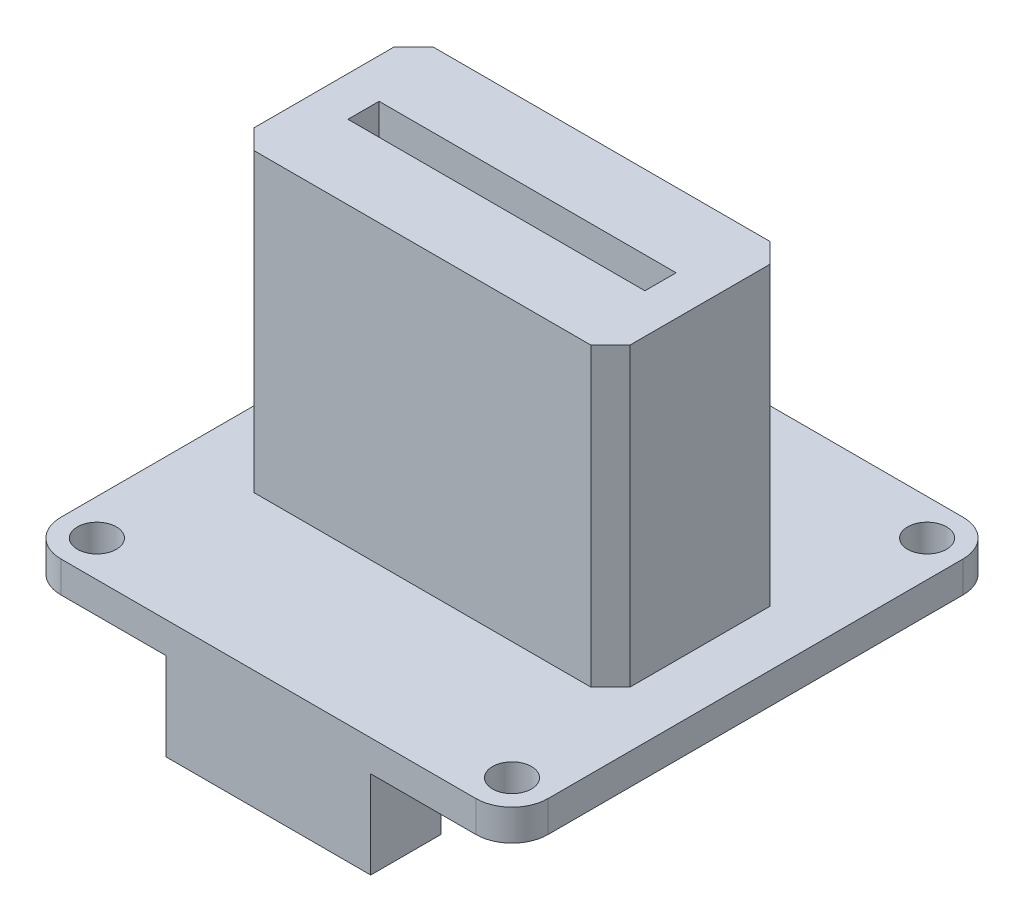
ISO-10303-21;
HEADER;
FILE_DESCRIPTION(('STEP AP214'),'2;1');
FILE_NAME('part.step','',(''),(''),'','','');
FILE_SCHEMA(('AUTOMOTIVE_DESIGN { 1 0 10303 214 1 1 1 1 }'));
ENDSEC;
DATA;
#1=APPLICATION_CONTEXT('core data for automotive mechanical design processes');
#2=APPLICATION_PROTOCOL_DEFINITION('international standard','automotive_design',2000,#1);
#3=PRODUCT_CONTEXT('',#1,'mechanical');
#4=PRODUCT('Part','Part','',(#3));
#5=PRODUCT_RELATED_PRODUCT_CATEGORY('part','',(#4));
#6=PRODUCT_DEFINITION_FORMATION('','',#4);
#7=PRODUCT_DEFINITION_CONTEXT('part definition',#1,'design');
#8=PRODUCT_DEFINITION('design','',#6,#7);
#9=PRODUCT_DEFINITION_SHAPE('','',#8);
#10=(LENGTH_UNIT() NAMED_UNIT(*) SI_UNIT(.MILLI.,.METRE.));
#11=(NAMED_UNIT(*) PLANE_ANGLE_UNIT() SI_UNIT($,.RADIAN.));
#12=(NAMED_UNIT(*) SI_UNIT($,.STERADIAN.) SOLID_ANGLE_UNIT());
#13=UNCERTAINTY_MEASURE_WITH_UNIT(LENGTH_MEASURE(1.E-05),#10,'distance_accuracy_value','');
#14=(GEOMETRIC_REPRESENTATION_CONTEXT(3) GLOBAL_UNCERTAINTY_ASSIGNED_CONTEXT((#13)) GLOBAL_UNIT_ASSIGNED_CONTEXT((#10,
#11,#12)) REPRESENTATION_CONTEXT('',''));
#15=CARTESIAN_POINT('',(0.,0.,0.));
#16=DIRECTION('',(0.,0.,1.));
#17=DIRECTION('',(1.,0.,0.));
#18=AXIS2_PLACEMENT_3D('',#15,#16,#17);
#19=CARTESIAN_POINT('',(-10.65,1.6,10.65));
#20=DIRECTION('',(0.,1.,0.));
#21=DIRECTION('',(0.,0.,1.));
#22=AXIS2_PLACEMENT_3D('',#19,#20,#21);
#23=PLANE('',#22);
#24=DIRECTION('',(-0.707106781186548,0.,0.707106781186547));
#25=VECTOR('',#24,1.);
#26=CARTESIAN_POINT('',(-6.62499999999999,1.6,-6.625));
#27=LINE('',#26,#25);
#28=CARTESIAN_POINT('',(-8.65,1.6,-4.6));
#29=VERTEX_POINT('',#28);
#30=CARTESIAN_POINT('',(-9.65,1.6,-3.6));
#31=VERTEX_POINT('',#30);
#32=EDGE_CURVE('E306',#29,#31,#27,.T.);
#33=ORIENTED_EDGE('',*,*,#32,.F.);
#34=DIRECTION('',(1.,0.,0.));
#35=VECTOR('',#34,1.);
#36=CARTESIAN_POINT('',(-10.65,1.6,-4.6));
#37=LINE('',#36,#35);
#38=CARTESIAN_POINT('',(8.65,1.6,-4.6));
#39=VERTEX_POINT('',#38);
#40=EDGE_CURVE('E351',#29,#39,#37,.T.);
#41=ORIENTED_EDGE('',*,*,#40,.T.);
#42=DIRECTION('',(-0.707106781186548,0.,-0.707106781186547));
#43=VECTOR('',#42,1.);
#44=CARTESIAN_POINT('',(6.625,1.6,-6.625));
#45=LINE('',#44,#43);
#46=CARTESIAN_POINT('',(9.65,1.6,-3.6));
#47=VERTEX_POINT('',#46);
#48=EDGE_CURVE('E322',#47,#39,#45,.T.);
#49=ORIENTED_EDGE('',*,*,#48,.F.);
#50=DIRECTION('',(0.,0.,1.));
#51=VECTOR('',#50,1.);
#52=CARTESIAN_POINT('',(9.65000000000001,1.6,10.65));
#53=LINE('',#52,#51);
#54=CARTESIAN_POINT('',(9.65,1.6,3.6));
#55=VERTEX_POINT('',#54);
#56=EDGE_CURVE('E374',#47,#55,#53,.T.);
#57=ORIENTED_EDGE('',*,*,#56,.T.);
#58=DIRECTION('',(0.707106781186547,0.,-0.707106781186548));
#59=VECTOR('',#58,1.);
#60=CARTESIAN_POINT('',(6.62500000000001,1.6,6.625));
#61=LINE('',#60,#59);
#62=CARTESIAN_POINT('',(8.65000000000001,1.6,4.6));
#63=VERTEX_POINT('',#62);
#64=EDGE_CURVE('E290',#63,#55,#61,.T.);
#65=ORIENTED_EDGE('',*,*,#64,.F.);
#66=DIRECTION('',(-1.,0.,0.));
#67=VECTOR('',#66,1.);
#68=CARTESIAN_POINT('',(-10.65,1.6,4.6));
#69=LINE('',#68,#67);
#70=CARTESIAN_POINT('',(-8.65,1.6,4.6));
#71=VERTEX_POINT('',#70);
#72=EDGE_CURVE('E377',#63,#71,#69,.T.);
#73=ORIENTED_EDGE('',*,*,#72,.T.);
#74=DIRECTION('',(0.707106781186548,0.,0.707106781186547));
#75=VECTOR('',#74,1.);
#76=CARTESIAN_POINT('',(-6.625,1.6,6.625));
#77=LINE('',#76,#75);
#78=CARTESIAN_POINT('',(-9.65,1.6,3.6));
#79=VERTEX_POINT('',#78);
#80=EDGE_CURVE('E297',#79,#71,#77,.T.);
#81=ORIENTED_EDGE('',*,*,#80,.F.);
#82=DIRECTION('',(0.,0.,-1.));
#83=VECTOR('',#82,1.);
#84=CARTESIAN_POINT('',(-9.65,1.6,10.65));
#85=LINE('',#84,#83);
#86=EDGE_CURVE('E362',#79,#31,#85,.T.);
#87=ORIENTED_EDGE('',*,*,#86,.T.);
#88=EDGE_LOOP('',(#33,#41,#49,#57,#65,#73,#81,#87));
#89=FACE_BOUND('',#88,.T.);
#90=CARTESIAN_POINT('',(-10.65,1.6,10.65));
#91=DIRECTION('',(0.,1.,0.));
#92=DIRECTION('',(0.,0.,1.));
#93=AXIS2_PLACEMENT_3D('',#90,#91,#92);
#94=CIRCLE('',#93,1.);
#95=CARTESIAN_POINT('',(-10.65,1.6,11.65));
#96=VERTEX_POINT('',#95);
#97=EDGE_CURVE('E388',#96,#96,#94,.T.);
#98=ORIENTED_EDGE('',*,*,#97,.F.);
#99=EDGE_LOOP('',(#98));
#100=FACE_BOUND('',#99,.T.);
#101=CARTESIAN_POINT('',(-10.65,1.6,-10.65));
#102=DIRECTION('',(0.,1.,0.));
#103=DIRECTION('',(0.,0.,1.));
#104=AXIS2_PLACEMENT_3D('',#101,#102,#103);
#105=CIRCLE('',#104,0.999999999999999);
#106=CARTESIAN_POINT('',(-10.65,1.6,-9.65));
#107=VERTEX_POINT('',#106);
#108=EDGE_CURVE('E400',#107,#107,#105,.T.);
#109=ORIENTED_EDGE('',*,*,#108,.F.);
#110=EDGE_LOOP('',(#109));
#111=FACE_BOUND('',#110,.T.);
#112=CARTESIAN_POINT('',(-10.65,1.6,10.65));
#113=DIRECTION('',(0.,1.,0.));
#114=DIRECTION('',(0.,0.,1.));
#115=AXIS2_PLACEMENT_3D('',#112,#113,#114);
#116=CIRCLE('',#115,1.85);
#117=CARTESIAN_POINT('',(-12.5,1.6,10.65));
#118=VERTEX_POINT('',#117);
#119=CARTESIAN_POINT('',(-10.65,1.6,12.5));
#120=VERTEX_POINT('',#119);
#121=EDGE_CURVE('E406',#118,#120,#116,.T.);
#122=ORIENTED_EDGE('',*,*,#121,.T.);
#123=DIRECTION('',(1.,0.,0.));
#124=VECTOR('',#123,1.);
#125=CARTESIAN_POINT('',(-10.65,1.6,12.5));
#126=LINE('',#125,#124);
#127=CARTESIAN_POINT('',(10.65,1.6,12.5));
#128=VERTEX_POINT('',#127);
#129=EDGE_CURVE('E409',#120,#128,#126,.T.);
#130=ORIENTED_EDGE('',*,*,#129,.T.);
#131=CARTESIAN_POINT('',(10.65,1.6,10.65));
#132=DIRECTION('',(0.,1.,0.));
#133=DIRECTION('',(0.,0.,1.));
#134=AXIS2_PLACEMENT_3D('',#131,#132,#133);
#135=CIRCLE('',#134,1.85);
#136=CARTESIAN_POINT('',(12.5,1.6,10.65));
#137=VERTEX_POINT('',#136);
#138=EDGE_CURVE('E412',#128,#137,#135,.T.);
#139=ORIENTED_EDGE('',*,*,#138,.T.);
#140=DIRECTION('',(0.,0.,-1.));
#141=VECTOR('',#140,1.);
#142=CARTESIAN_POINT('',(12.5,1.6,-10.65));
#143=LINE('',#142,#141);
#144=CARTESIAN_POINT('',(12.5,1.6,-10.65));
#145=VERTEX_POINT('',#144);
#146=EDGE_CURVE('E414',#137,#145,#143,.T.);
#147=ORIENTED_EDGE('',*,*,#146,.T.);
#148=CARTESIAN_POINT('',(10.65,1.6,-10.65));
#149=DIRECTION('',(0.,1.,0.));
#150=DIRECTION('',(0.,0.,1.));
#151=AXIS2_PLACEMENT_3D('',#148,#149,#150);
#152=CIRCLE('',#151,1.85);
#153=CARTESIAN_POINT('',(10.65,1.6,-12.5));
#154=VERTEX_POINT('',#153);
#155=EDGE_CURVE('E416',#145,#154,#152,.T.);
#156=ORIENTED_EDGE('',*,*,#155,.T.);
#157=DIRECTION('',(-1.,0.,0.));
#158=VECTOR('',#157,1.);
#159=CARTESIAN_POINT('',(-10.65,1.6,-12.5));
#160=LINE('',#159,#158);
#161=CARTESIAN_POINT('',(-10.65,1.6,-12.5));
#162=VERTEX_POINT('',#161);
#163=EDGE_CURVE('E418',#154,#162,#160,.T.);
#164=ORIENTED_EDGE('',*,*,#163,.T.);
#165=CARTESIAN_POINT('',(-10.65,1.6,-10.65));
#166=DIRECTION('',(0.,1.,0.));
#167=DIRECTION('',(0.,0.,1.));
#168=AXIS2_PLACEMENT_3D('',#165,#166,#167);
#169=CIRCLE('',#168,1.85);
#170=CARTESIAN_POINT('',(-12.5,1.6,-10.65));
#171=VERTEX_POINT('',#170);
#172=EDGE_CURVE('E420',#162,#171,#169,.T.);
#173=ORIENTED_EDGE('',*,*,#172,.T.);
#174=DIRECTION('',(0.,0.,1.));
#175=VECTOR('',#174,1.);
#176=CARTESIAN_POINT('',(-12.5,1.6,-10.65));
#177=LINE('',#176,#175);
#178=EDGE_CURVE('E422',#171,#118,#177,.T.);
#179=ORIENTED_EDGE('',*,*,#178,.T.);
#180=EDGE_LOOP('',(#122,#130,#139,#147,#156,#164,#173,#179));
#181=FACE_BOUND('',#180,.T.);
#182=CARTESIAN_POINT('',(10.65,1.6,-10.65));
#183=DIRECTION('',(0.,1.,0.));
#184=DIRECTION('',(0.,0.,1.));
#185=AXIS2_PLACEMENT_3D('',#182,#183,#184);
#186=CIRCLE('',#185,1.);
#187=CARTESIAN_POINT('',(10.65,1.6,-9.64999999999999));
#188=VERTEX_POINT('',#187);
#189=EDGE_CURVE('E394',#188,#188,#186,.T.);
#190=ORIENTED_EDGE('',*,*,#189,.F.);
#191=EDGE_LOOP('',(#190));
#192=FACE_BOUND('',#191,.T.);
#193=CARTESIAN_POINT('',(10.65,1.6,10.65));
#194=DIRECTION('',(0.,1.,0.));
#195=DIRECTION('',(0.,0.,1.));
#196=AXIS2_PLACEMENT_3D('',#193,#194,#195);
#197=CIRCLE('',#196,1.);
#198=CARTESIAN_POINT('',(10.65,1.6,11.65));
#199=VERTEX_POINT('',#198);
#200=EDGE_CURVE('E382',#199,#199,#197,.T.);
#201=ORIENTED_EDGE('',*,*,#200,.F.);
#202=EDGE_LOOP('',(#201));
#203=FACE_BOUND('',#202,.T.);
#204=ADVANCED_FACE('F42',(#89,#100,#111,#181,#192,#203),#23,.T.);
#205=CARTESIAN_POINT('',(-10.65,0.,10.65));
#206=DIRECTION('',(0.,1.,0.));
#207=DIRECTION('',(0.,0.,1.));
#208=AXIS2_PLACEMENT_3D('',#205,#206,#207);
#209=PLANE('',#208);
#210=DIRECTION('',(-1.,0.,0.));
#211=VECTOR('',#210,1.);
#212=CARTESIAN_POINT('',(-10.65,0.,-12.5));
#213=LINE('',#212,#211);
#214=CARTESIAN_POINT('',(-7.5,0.,-12.5));
#215=VERTEX_POINT('',#214);
#216=CARTESIAN_POINT('',(-10.65,0.,-12.5));
#217=VERTEX_POINT('',#216);
#218=EDGE_CURVE('E437',#215,#217,#213,.T.);
#219=ORIENTED_EDGE('',*,*,#218,.F.);
#220=DIRECTION('',(0.,0.,1.));
#221=VECTOR('',#220,1.);
#222=CARTESIAN_POINT('',(-7.5,0.,-8.9));
#223=LINE('',#222,#221);
#224=CARTESIAN_POINT('',(-7.5,0.,-8.9));
#225=VERTEX_POINT('',#224);
#226=EDGE_CURVE('E57',#215,#225,#223,.T.);
#227=ORIENTED_EDGE('',*,*,#226,.T.);
#228=DIRECTION('',(1.,0.,0.));
#229=VECTOR('',#228,1.);
#230=CARTESIAN_POINT('',(-7.5,0.,-8.9));
#231=LINE('',#230,#229);
#232=CARTESIAN_POINT('',(7.5,0.,-8.9));
#233=VERTEX_POINT('',#232);
#234=EDGE_CURVE('E232',#225,#233,#231,.T.);
#235=ORIENTED_EDGE('',*,*,#234,.T.);
#236=DIRECTION('',(0.,0.,-1.));
#237=VECTOR('',#236,1.);
#238=CARTESIAN_POINT('',(7.5,0.,-8.9));
#239=LINE('',#238,#237);
#240=CARTESIAN_POINT('',(7.5,0.,-12.5));
#241=VERTEX_POINT('',#240);
#242=EDGE_CURVE('E249',#233,#241,#239,.T.);
#243=ORIENTED_EDGE('',*,*,#242,.T.);
#244=CARTESIAN_POINT('',(10.65,0.,-12.5));
#245=VERTEX_POINT('',#244);
#246=EDGE_CURVE('E438',#245,#241,#213,.T.);
#247=ORIENTED_EDGE('',*,*,#246,.F.);
#248=CARTESIAN_POINT('',(10.65,0.,-10.65));
#249=DIRECTION('',(0.,1.,0.));
#250=DIRECTION('',(0.,0.,1.));
#251=AXIS2_PLACEMENT_3D('',#248,#249,#250);
#252=CIRCLE('',#251,1.85);
#253=CARTESIAN_POINT('',(12.5,0.,-10.65));
#254=VERTEX_POINT('',#253);
#255=EDGE_CURVE('E435',#254,#245,#252,.T.);
#256=ORIENTED_EDGE('',*,*,#255,.F.);
#257=DIRECTION('',(0.,0.,-1.));
#258=VECTOR('',#257,1.);
#259=CARTESIAN_POINT('',(12.5,0.,-10.65));
#260=LINE('',#259,#258);
#261=CARTESIAN_POINT('',(12.5,0.,10.65));
#262=VERTEX_POINT('',#261);
#263=EDGE_CURVE('E433',#262,#254,#260,.T.);
#264=ORIENTED_EDGE('',*,*,#263,.F.);
#265=CARTESIAN_POINT('',(10.65,0.,10.65));
#266=DIRECTION('',(0.,1.,0.));
#267=DIRECTION('',(0.,0.,1.));
#268=AXIS2_PLACEMENT_3D('',#265,#266,#267);
#269=CIRCLE('',#268,1.85);
#270=CARTESIAN_POINT('',(10.65,0.,12.5));
#271=VERTEX_POINT('',#270);
#272=EDGE_CURVE('E431',#271,#262,#269,.T.);
#273=ORIENTED_EDGE('',*,*,#272,.F.);
#274=DIRECTION('',(1.,0.,0.));
#275=VECTOR('',#274,1.);
#276=CARTESIAN_POINT('',(-10.65,0.,12.5));
#277=LINE('',#276,#275);
#278=CARTESIAN_POINT('',(5.25,0.,12.5));
#279=VERTEX_POINT('',#278);
#280=EDGE_CURVE('E427',#279,#271,#277,.T.);
#281=ORIENTED_EDGE('',*,*,#280,.F.);
#282=DIRECTION('',(0.,0.,-1.));
#283=VECTOR('',#282,1.);
#284=CARTESIAN_POINT('',(5.25,0.,12.5));
#285=LINE('',#284,#283);
#286=CARTESIAN_POINT('',(5.25,0.,8.9));
#287=VERTEX_POINT('',#286);
#288=EDGE_CURVE('E277',#279,#287,#285,.T.);
#289=ORIENTED_EDGE('',*,*,#288,.T.);
#290=DIRECTION('',(-1.,0.,0.));
#291=VECTOR('',#290,1.);
#292=CARTESIAN_POINT('',(-5.25,0.,8.9));
#293=LINE('',#292,#291);
#294=CARTESIAN_POINT('',(-5.25,0.,8.9));
#295=VERTEX_POINT('',#294);
#296=EDGE_CURVE('E266',#287,#295,#293,.T.);
#297=ORIENTED_EDGE('',*,*,#296,.T.);
#298=DIRECTION('',(0.,0.,1.));
#299=VECTOR('',#298,1.);
#300=CARTESIAN_POINT('',(-5.25,0.,12.5));
#301=LINE('',#300,#299);
#302=CARTESIAN_POINT('',(-5.25,0.,12.5));
#303=VERTEX_POINT('',#302);
#304=EDGE_CURVE('E65',#295,#303,#301,.T.);
#305=ORIENTED_EDGE('',*,*,#304,.T.);
#306=CARTESIAN_POINT('',(-10.65,0.,12.5));
#307=VERTEX_POINT('',#306);
#308=EDGE_CURVE('E428',#307,#303,#277,.T.);
#309=ORIENTED_EDGE('',*,*,#308,.F.);
#310=CARTESIAN_POINT('',(-10.65,0.,10.65));
#311=DIRECTION('',(0.,1.,0.));
#312=DIRECTION('',(0.,0.,1.));
#313=AXIS2_PLACEMENT_3D('',#310,#311,#312);
#314=CIRCLE('',#313,1.85);
#315=CARTESIAN_POINT('',(-12.5,0.,10.65));
#316=VERTEX_POINT('',#315);
#317=EDGE_CURVE('E403',#316,#307,#314,.T.);
#318=ORIENTED_EDGE('',*,*,#317,.F.);
#319=DIRECTION('',(0.,0.,1.));
#320=VECTOR('',#319,1.);
#321=CARTESIAN_POINT('',(-12.5,0.,-10.65));
#322=LINE('',#321,#320);
#323=CARTESIAN_POINT('',(-12.5,0.,-10.65));
#324=VERTEX_POINT('',#323);
#325=EDGE_CURVE('E410',#324,#316,#322,.T.);
#326=ORIENTED_EDGE('',*,*,#325,.F.);
#327=CARTESIAN_POINT('',(-10.65,0.,-10.65));
#328=DIRECTION('',(0.,1.,0.));
#329=DIRECTION('',(0.,0.,1.));
#330=AXIS2_PLACEMENT_3D('',#327,#328,#329);
#331=CIRCLE('',#330,1.85);
#332=EDGE_CURVE('E441',#217,#324,#331,.T.);
#333=ORIENTED_EDGE('',*,*,#332,.F.);
#334=EDGE_LOOP('',(#219,#227,#235,#243,#247,#256,#264,#273,#281,#289,#297,#305,#309,#318,#326,#333));
#335=FACE_BOUND('',#334,.T.);
#336=CARTESIAN_POINT('',(-10.65,0.,-10.65));
#337=DIRECTION('',(0.,1.,0.));
#338=DIRECTION('',(0.,0.,1.));
#339=AXIS2_PLACEMENT_3D('',#336,#337,#338);
#340=CIRCLE('',#339,0.999999999999999);
#341=CARTESIAN_POINT('',(-10.65,0.,-9.65));
#342=VERTEX_POINT('',#341);
#343=EDGE_CURVE('E397',#342,#342,#340,.T.);
#344=ORIENTED_EDGE('',*,*,#343,.T.);
#345=EDGE_LOOP('',(#344));
#346=FACE_BOUND('',#345,.T.);
#347=CARTESIAN_POINT('',(10.65,0.,-10.65));
#348=DIRECTION('',(0.,1.,0.));
#349=DIRECTION('',(0.,0.,1.));
#350=AXIS2_PLACEMENT_3D('',#347,#348,#349);
#351=CIRCLE('',#350,1.);
#352=CARTESIAN_POINT('',(10.65,0.,-9.64999999999999));
#353=VERTEX_POINT('',#352);
#354=EDGE_CURVE('E391',#353,#353,#351,.T.);
#355=ORIENTED_EDGE('',*,*,#354,.T.);
#356=EDGE_LOOP('',(#355));
#357=FACE_BOUND('',#356,.T.);
#358=CARTESIAN_POINT('',(-10.65,0.,10.65));
#359=DIRECTION('',(0.,1.,0.));
#360=DIRECTION('',(0.,0.,1.));
#361=AXIS2_PLACEMENT_3D('',#358,#359,#360);
#362=CIRCLE('',#361,1.);
#363=CARTESIAN_POINT('',(-10.65,0.,11.65));
#364=VERTEX_POINT('',#363);
#365=EDGE_CURVE('E385',#364,#364,#362,.T.);
#366=ORIENTED_EDGE('',*,*,#365,.T.);
#367=EDGE_LOOP('',(#366));
#368=FACE_BOUND('',#367,.T.);
#369=CARTESIAN_POINT('',(10.65,0.,10.65));
#370=DIRECTION('',(0.,1.,0.));
#371=DIRECTION('',(0.,0.,1.));
#372=AXIS2_PLACEMENT_3D('',#369,#370,#371);
#373=CIRCLE('',#372,1.);
#374=CARTESIAN_POINT('',(10.65,0.,11.65));
#375=VERTEX_POINT('',#374);
#376=EDGE_CURVE('E371',#375,#375,#373,.T.);
#377=ORIENTED_EDGE('',*,*,#376,.T.);
#378=EDGE_LOOP('',(#377));
#379=FACE_BOUND('',#378,.T.);
#380=ADVANCED_FACE('F472',(#335,#346,#357,#368,#379),#209,.F.);
#381=CARTESIAN_POINT('',(-10.65,1.6,10.65));
#382=DIRECTION('',(0.,-1.,0.));
#383=DIRECTION('',(0.,0.,-1.));
#384=AXIS2_PLACEMENT_3D('',#381,#382,#383);
#385=CYLINDRICAL_SURFACE('',#384,1.85);
#386=ORIENTED_EDGE('',*,*,#317,.T.);
#387=DIRECTION('',(0.,-1.,0.));
#388=VECTOR('',#387,1.);
#389=CARTESIAN_POINT('',(-10.65,1.6,12.5));
#390=LINE('',#389,#388);
#391=EDGE_CURVE('E11',#120,#307,#390,.T.);
#392=ORIENTED_EDGE('',*,*,#391,.F.);
#393=ORIENTED_EDGE('',*,*,#121,.F.);
#394=DIRECTION('',(0.,-1.,0.));
#395=VECTOR('',#394,1.);
#396=CARTESIAN_POINT('',(-12.5,1.6,10.65));
#397=LINE('',#396,#395);
#398=EDGE_CURVE('E424',#118,#316,#397,.T.);
#399=ORIENTED_EDGE('',*,*,#398,.T.);
#400=EDGE_LOOP('',(#386,#392,#393,#399));
#401=FACE_BOUND('',#400,.T.);
#402=ADVANCED_FACE('F44',(#401),#385,.T.);
#403=CARTESIAN_POINT('',(-10.65,1.6,12.5));
#404=DIRECTION('',(0.,0.,-1.));
#405=DIRECTION('',(-1.,0.,0.));
#406=AXIS2_PLACEMENT_3D('',#403,#404,#405);
#407=PLANE('',#406);
#408=ORIENTED_EDGE('',*,*,#308,.T.);
#409=DIRECTION('',(0.,1.,0.));
#410=VECTOR('',#409,1.);
#411=CARTESIAN_POINT('',(-5.25,-4.5,12.5));
#412=LINE('',#411,#410);
#413=CARTESIAN_POINT('',(-5.25,-4.5,12.5));
#414=VERTEX_POINT('',#413);
#415=EDGE_CURVE('E275',#414,#303,#412,.T.);
#416=ORIENTED_EDGE('',*,*,#415,.F.);
#417=DIRECTION('',(1.,0.,0.));
#418=VECTOR('',#417,1.);
#419=CARTESIAN_POINT('',(-5.25,-4.5,12.5));
#420=LINE('',#419,#418);
#421=CARTESIAN_POINT('',(5.25,-4.5,12.5));
#422=VERTEX_POINT('',#421);
#423=EDGE_CURVE('E265',#414,#422,#420,.T.);
#424=ORIENTED_EDGE('',*,*,#423,.T.);
#425=DIRECTION('',(0.,1.,0.));
#426=VECTOR('',#425,1.);
#427=CARTESIAN_POINT('',(5.25,-4.5,12.5));
#428=LINE('',#427,#426);
#429=EDGE_CURVE('E287',#422,#279,#428,.T.);
#430=ORIENTED_EDGE('',*,*,#429,.T.);
#431=ORIENTED_EDGE('',*,*,#280,.T.);
#432=DIRECTION('',(0.,-1.,0.));
#433=VECTOR('',#432,1.);
#434=CARTESIAN_POINT('',(10.65,1.6,12.5));
#435=LINE('',#434,#433);
#436=EDGE_CURVE('E50',#128,#271,#435,.T.);
#437=ORIENTED_EDGE('',*,*,#436,.F.);
#438=ORIENTED_EDGE('',*,*,#129,.F.);
#439=ORIENTED_EDGE('',*,*,#391,.T.);
#440=EDGE_LOOP('',(#408,#416,#424,#430,#431,#437,#438,#439));
#441=FACE_BOUND('',#440,.T.);
#442=ADVANCED_FACE('F490',(#441),#407,.F.);
#443=CARTESIAN_POINT('',(10.65,1.6,10.65));
#444=DIRECTION('',(0.,-1.,0.));
#445=DIRECTION('',(0.,0.,-1.));
#446=AXIS2_PLACEMENT_3D('',#443,#444,#445);
#447=CYLINDRICAL_SURFACE('',#446,1.85);
#448=ORIENTED_EDGE('',*,*,#272,.T.);
#449=DIRECTION('',(0.,-1.,0.));
#450=VECTOR('',#449,1.);
#451=CARTESIAN_POINT('',(12.5,1.6,10.65));
#452=LINE('',#451,#450);
#453=EDGE_CURVE('E458',#137,#262,#452,.T.);
#454=ORIENTED_EDGE('',*,*,#453,.F.);
#455=ORIENTED_EDGE('',*,*,#138,.F.);
#456=ORIENTED_EDGE('',*,*,#436,.T.);
#457=EDGE_LOOP('',(#448,#454,#455,#456));
#458=FACE_BOUND('',#457,.T.);
#459=ADVANCED_FACE('F465',(#458),#447,.T.);
#460=CARTESIAN_POINT('',(12.5,1.6,-10.65));
#461=DIRECTION('',(-1.,0.,0.));
#462=DIRECTION('',(0.,0.,1.));
#463=AXIS2_PLACEMENT_3D('',#460,#461,#462);
#464=PLANE('',#463);
#465=ORIENTED_EDGE('',*,*,#263,.T.);
#466=DIRECTION('',(0.,-1.,0.));
#467=VECTOR('',#466,1.);
#468=CARTESIAN_POINT('',(12.5,1.6,-10.65));
#469=LINE('',#468,#467);
#470=EDGE_CURVE('E455',#145,#254,#469,.T.);
#471=ORIENTED_EDGE('',*,*,#470,.F.);
#472=ORIENTED_EDGE('',*,*,#146,.F.);
#473=ORIENTED_EDGE('',*,*,#453,.T.);
#474=EDGE_LOOP('',(#465,#471,#472,#473));
#475=FACE_BOUND('',#474,.T.);
#476=ADVANCED_FACE('F478',(#475),#464,.F.);
#477=CARTESIAN_POINT('',(10.65,1.6,-10.65));
#478=DIRECTION('',(0.,-1.,0.));
#479=DIRECTION('',(0.,0.,-1.));
#480=AXIS2_PLACEMENT_3D('',#477,#478,#479);
#481=CYLINDRICAL_SURFACE('',#480,1.85);
#482=ORIENTED_EDGE('',*,*,#255,.T.);
#483=DIRECTION('',(0.,-1.,0.));
#484=VECTOR('',#483,1.);
#485=CARTESIAN_POINT('',(10.65,1.6,-12.5));
#486=LINE('',#485,#484);
#487=EDGE_CURVE('E452',#154,#245,#486,.T.);
#488=ORIENTED_EDGE('',*,*,#487,.F.);
#489=ORIENTED_EDGE('',*,*,#155,.F.);
#490=ORIENTED_EDGE('',*,*,#470,.T.);
#491=EDGE_LOOP('',(#482,#488,#489,#490));
#492=FACE_BOUND('',#491,.T.);
#493=ADVANCED_FACE('F482',(#492),#481,.T.);
#494=CARTESIAN_POINT('',(-10.65,1.6,-12.5));
#495=DIRECTION('',(0.,0.,1.));
#496=DIRECTION('',(1.,0.,0.));
#497=AXIS2_PLACEMENT_3D('',#494,#495,#496);
#498=PLANE('',#497);
#499=ORIENTED_EDGE('',*,*,#246,.T.);
#500=DIRECTION('',(0.,1.,0.));
#501=VECTOR('',#500,1.);
#502=CARTESIAN_POINT('',(7.5,-4.5,-12.5));
#503=LINE('',#502,#501);
#504=CARTESIAN_POINT('',(7.5,-4.5,-12.5));
#505=VERTEX_POINT('',#504);
#506=EDGE_CURVE('E259',#505,#241,#503,.T.);
#507=ORIENTED_EDGE('',*,*,#506,.F.);
#508=DIRECTION('',(-1.,0.,0.));
#509=VECTOR('',#508,1.);
#510=CARTESIAN_POINT('',(-7.5,-4.5,-12.5));
#511=LINE('',#510,#509);
#512=CARTESIAN_POINT('',(-7.5,-4.5,-12.5));
#513=VERTEX_POINT('',#512);
#514=EDGE_CURVE('E235',#505,#513,#511,.T.);
#515=ORIENTED_EDGE('',*,*,#514,.T.);
#516=DIRECTION('',(0.,1.,0.));
#517=VECTOR('',#516,1.);
#518=CARTESIAN_POINT('',(-7.5,-4.5,-12.5));
#519=LINE('',#518,#517);
#520=EDGE_CURVE('E248',#513,#215,#519,.T.);
#521=ORIENTED_EDGE('',*,*,#520,.T.);
#522=ORIENTED_EDGE('',*,*,#218,.T.);
#523=DIRECTION('',(0.,-1.,0.));
#524=VECTOR('',#523,1.);
#525=CARTESIAN_POINT('',(-10.65,1.6,-12.5));
#526=LINE('',#525,#524);
#527=EDGE_CURVE('E449',#162,#217,#526,.T.);
#528=ORIENTED_EDGE('',*,*,#527,.F.);
#529=ORIENTED_EDGE('',*,*,#163,.F.);
#530=ORIENTED_EDGE('',*,*,#487,.T.);
#531=EDGE_LOOP('',(#499,#507,#515,#521,#522,#528,#529,#530));
#532=FACE_BOUND('',#531,.T.);
#533=ADVANCED_FACE('F538',(#532),#498,.F.);
#534=CARTESIAN_POINT('',(-10.65,1.6,-10.65));
#535=DIRECTION('',(0.,-1.,0.));
#536=DIRECTION('',(0.,0.,-1.));
#537=AXIS2_PLACEMENT_3D('',#534,#535,#536);
#538=CYLINDRICAL_SURFACE('',#537,1.85);
#539=ORIENTED_EDGE('',*,*,#332,.T.);
#540=DIRECTION('',(0.,-1.,0.));
#541=VECTOR('',#540,1.);
#542=CARTESIAN_POINT('',(-12.5,1.6,-10.65));
#543=LINE('',#542,#541);
#544=EDGE_CURVE('E446',#171,#324,#543,.T.);
#545=ORIENTED_EDGE('',*,*,#544,.F.);
#546=ORIENTED_EDGE('',*,*,#172,.F.);
#547=ORIENTED_EDGE('',*,*,#527,.T.);
#548=EDGE_LOOP('',(#539,#545,#546,#547));
#549=FACE_BOUND('',#548,.T.);
#550=ADVANCED_FACE('F534',(#549),#538,.T.);
#551=CARTESIAN_POINT('',(-12.5,1.6,-10.65));
#552=DIRECTION('',(1.,0.,0.));
#553=DIRECTION('',(0.,0.,-1.));
#554=AXIS2_PLACEMENT_3D('',#551,#552,#553);
#555=PLANE('',#554);
#556=ORIENTED_EDGE('',*,*,#325,.T.);
#557=ORIENTED_EDGE('',*,*,#398,.F.);
#558=ORIENTED_EDGE('',*,*,#178,.F.);
#559=ORIENTED_EDGE('',*,*,#544,.T.);
#560=EDGE_LOOP('',(#556,#557,#558,#559));
#561=FACE_BOUND('',#560,.T.);
#562=ADVANCED_FACE('F531',(#561),#555,.F.);
#563=CARTESIAN_POINT('',(-10.65,1.6,-10.65));
#564=DIRECTION('',(0.,-1.,0.));
#565=DIRECTION('',(0.,0.,-1.));
#566=AXIS2_PLACEMENT_3D('',#563,#564,#565);
#567=CYLINDRICAL_SURFACE('',#566,0.999999999999999);
#568=ORIENTED_EDGE('',*,*,#108,.T.);
#569=EDGE_LOOP('',(#568));
#570=FACE_BOUND('',#569,.T.);
#571=ORIENTED_EDGE('',*,*,#343,.F.);
#572=EDGE_LOOP('',(#571));
#573=FACE_BOUND('',#572,.T.);
#574=ADVANCED_FACE('F528',(#570,#573),#567,.F.);
#575=CARTESIAN_POINT('',(10.65,1.6,-10.65));
#576=DIRECTION('',(0.,-1.,0.));
#577=DIRECTION('',(0.,0.,-1.));
#578=AXIS2_PLACEMENT_3D('',#575,#576,#577);
#579=CYLINDRICAL_SURFACE('',#578,1.);
#580=ORIENTED_EDGE('',*,*,#189,.T.);
#581=EDGE_LOOP('',(#580));
#582=FACE_BOUND('',#581,.T.);
#583=ORIENTED_EDGE('',*,*,#354,.F.);
#584=EDGE_LOOP('',(#583));
#585=FACE_BOUND('',#584,.T.);
#586=ADVANCED_FACE('F768',(#582,#585),#579,.F.);
#587=CARTESIAN_POINT('',(-10.65,1.6,10.65));
#588=DIRECTION('',(0.,-1.,0.));
#589=DIRECTION('',(0.,0.,-1.));
#590=AXIS2_PLACEMENT_3D('',#587,#588,#589);
#591=CYLINDRICAL_SURFACE('',#590,1.);
#592=ORIENTED_EDGE('',*,*,#97,.T.);
#593=EDGE_LOOP('',(#592));
#594=FACE_BOUND('',#593,.T.);
#595=ORIENTED_EDGE('',*,*,#365,.F.);
#596=EDGE_LOOP('',(#595));
#597=FACE_BOUND('',#596,.T.);
#598=ADVANCED_FACE('F760',(#594,#597),#591,.F.);
#599=CARTESIAN_POINT('',(10.65,1.6,10.65));
#600=DIRECTION('',(0.,-1.,0.));
#601=DIRECTION('',(0.,0.,-1.));
#602=AXIS2_PLACEMENT_3D('',#599,#600,#601);
#603=CYLINDRICAL_SURFACE('',#602,1.);
#604=ORIENTED_EDGE('',*,*,#200,.T.);
#605=EDGE_LOOP('',(#604));
#606=FACE_BOUND('',#605,.T.);
#607=ORIENTED_EDGE('',*,*,#376,.F.);
#608=EDGE_LOOP('',(#607));
#609=FACE_BOUND('',#608,.T.);
#610=ADVANCED_FACE('F753',(#606,#609),#603,.F.);
#611=CARTESIAN_POINT('',(-10.65,16.8,-4.6));
#612=DIRECTION('',(0.,0.,-1.));
#613=DIRECTION('',(-1.,0.,0.));
#614=AXIS2_PLACEMENT_3D('',#611,#612,#613);
#615=PLANE('',#614);
#616=DIRECTION('',(0.,1.,0.));
#617=VECTOR('',#616,1.);
#618=CARTESIAN_POINT('',(-8.65,0.185786437626904,-4.6));
#619=LINE('',#618,#617);
#620=CARTESIAN_POINT('',(-8.65,16.8,-4.6));
#621=VERTEX_POINT('',#620);
#622=EDGE_CURVE('E312',#29,#621,#619,.T.);
#623=ORIENTED_EDGE('',*,*,#622,.T.);
#624=DIRECTION('',(1.,0.,0.));
#625=VECTOR('',#624,1.);
#626=CARTESIAN_POINT('',(-10.65,16.8,-4.6));
#627=LINE('',#626,#625);
#628=CARTESIAN_POINT('',(8.65,16.8,-4.6));
#629=VERTEX_POINT('',#628);
#630=EDGE_CURVE('E358',#621,#629,#627,.T.);
#631=ORIENTED_EDGE('',*,*,#630,.T.);
#632=DIRECTION('',(0.,1.,0.));
#633=VECTOR('',#632,1.);
#634=CARTESIAN_POINT('',(8.65,0.185786437626904,-4.6));
#635=LINE('',#634,#633);
#636=EDGE_CURVE('E318',#39,#629,#635,.T.);
#637=ORIENTED_EDGE('',*,*,#636,.F.);
#638=ORIENTED_EDGE('',*,*,#40,.F.);
#639=EDGE_LOOP('',(#623,#631,#637,#638));
#640=FACE_BOUND('',#639,.T.);
#641=ADVANCED_FACE('F745',(#640),#615,.T.);
#642=CARTESIAN_POINT('',(-9.65,16.8,10.65));
#643=DIRECTION('',(-1.,0.,0.));
#644=DIRECTION('',(0.,0.,1.));
#645=AXIS2_PLACEMENT_3D('',#642,#643,#644);
#646=PLANE('',#645);
#647=DIRECTION('',(0.,1.,0.));
#648=VECTOR('',#647,1.);
#649=CARTESIAN_POINT('',(-9.65,0.185786437626904,-3.6));
#650=LINE('',#649,#648);
#651=CARTESIAN_POINT('',(-9.65,16.8,-3.59999999999999));
#652=VERTEX_POINT('',#651);
#653=EDGE_CURVE('E311',#31,#652,#650,.T.);
#654=ORIENTED_EDGE('',*,*,#653,.F.);
#655=ORIENTED_EDGE('',*,*,#86,.F.);
#656=DIRECTION('',(0.,1.,0.));
#657=VECTOR('',#656,1.);
#658=CARTESIAN_POINT('',(-9.65,0.185786437626904,3.6));
#659=LINE('',#658,#657);
#660=CARTESIAN_POINT('',(-9.65,16.8,3.6));
#661=VERTEX_POINT('',#660);
#662=EDGE_CURVE('E305',#79,#661,#659,.T.);
#663=ORIENTED_EDGE('',*,*,#662,.T.);
#664=DIRECTION('',(0.,0.,-1.));
#665=VECTOR('',#664,1.);
#666=CARTESIAN_POINT('',(-9.65,16.8,10.65));
#667=LINE('',#666,#665);
#668=EDGE_CURVE('E368',#661,#652,#667,.T.);
#669=ORIENTED_EDGE('',*,*,#668,.T.);
#670=EDGE_LOOP('',(#654,#655,#663,#669));
#671=FACE_BOUND('',#670,.T.);
#672=ADVANCED_FACE('F737',(#671),#646,.T.);
#673=CARTESIAN_POINT('',(-10.65,16.8,4.6));
#674=DIRECTION('',(0.,0.,1.));
#675=DIRECTION('',(1.,0.,0.));
#676=AXIS2_PLACEMENT_3D('',#673,#674,#675);
#677=PLANE('',#676);
#678=DIRECTION('',(0.,1.,0.));
#679=VECTOR('',#678,1.);
#680=CARTESIAN_POINT('',(-8.65,0.185786437626904,4.6));
#681=LINE('',#680,#679);
#682=CARTESIAN_POINT('',(-8.65,16.8,4.6));
#683=VERTEX_POINT('',#682);
#684=EDGE_CURVE('E302',#71,#683,#681,.T.);
#685=ORIENTED_EDGE('',*,*,#684,.F.);
#686=ORIENTED_EDGE('',*,*,#72,.F.);
#687=DIRECTION('',(0.,1.,0.));
#688=VECTOR('',#687,1.);
#689=CARTESIAN_POINT('',(8.65000000000001,0.185786437626904,4.6));
#690=LINE('',#689,#688);
#691=CARTESIAN_POINT('',(8.65000000000001,16.8,4.6));
#692=VERTEX_POINT('',#691);
#693=EDGE_CURVE('E296',#63,#692,#690,.T.);
#694=ORIENTED_EDGE('',*,*,#693,.T.);
#695=DIRECTION('',(-1.,0.,0.));
#696=VECTOR('',#695,1.);
#697=CARTESIAN_POINT('',(-10.65,16.8,4.6));
#698=LINE('',#697,#696);
#699=EDGE_CURVE('E365',#692,#683,#698,.T.);
#700=ORIENTED_EDGE('',*,*,#699,.T.);
#701=EDGE_LOOP('',(#685,#686,#694,#700));
#702=FACE_BOUND('',#701,.T.);
#703=ADVANCED_FACE('F729',(#702),#677,.T.);
#704=CARTESIAN_POINT('',(9.65000000000001,16.8,10.65));
#705=DIRECTION('',(1.,0.,0.));
#706=DIRECTION('',(0.,0.,-1.));
#707=AXIS2_PLACEMENT_3D('',#704,#705,#706);
#708=PLANE('',#707);
#709=DIRECTION('',(0.,1.,0.));
#710=VECTOR('',#709,1.);
#711=CARTESIAN_POINT('',(9.65,0.185786437626904,3.6));
#712=LINE('',#711,#710);
#713=CARTESIAN_POINT('',(9.65,16.8,3.6));
#714=VERTEX_POINT('',#713);
#715=EDGE_CURVE('E293',#55,#714,#712,.T.);
#716=ORIENTED_EDGE('',*,*,#715,.F.);
#717=ORIENTED_EDGE('',*,*,#56,.F.);
#718=DIRECTION('',(0.,1.,0.));
#719=VECTOR('',#718,1.);
#720=CARTESIAN_POINT('',(9.65,0.185786437626904,-3.6));
#721=LINE('',#720,#719);
#722=CARTESIAN_POINT('',(9.65,16.8,-3.6));
#723=VERTEX_POINT('',#722);
#724=EDGE_CURVE('E319',#47,#723,#721,.T.);
#725=ORIENTED_EDGE('',*,*,#724,.T.);
#726=DIRECTION('',(0.,0.,1.));
#727=VECTOR('',#726,1.);
#728=CARTESIAN_POINT('',(9.65000000000001,16.8,10.65));
#729=LINE('',#728,#727);
#730=EDGE_CURVE('E361',#723,#714,#729,.T.);
#731=ORIENTED_EDGE('',*,*,#730,.T.);
#732=EDGE_LOOP('',(#716,#717,#725,#731));
#733=FACE_BOUND('',#732,.T.);
#734=ADVANCED_FACE('F721',(#733),#708,.T.);
#735=CARTESIAN_POINT('',(0.,16.8,0.));
#736=DIRECTION('',(0.,-1.,0.));
#737=DIRECTION('',(0.,0.,-1.));
#738=AXIS2_PLACEMENT_3D('',#735,#736,#737);
#739=PLANE('',#738);
#740=DIRECTION('',(0.,0.,-1.));
#741=VECTOR('',#740,1.);
#742=CARTESIAN_POINT('',(7.62,16.8,0.));
#743=LINE('',#742,#741);
#744=CARTESIAN_POINT('',(7.62,16.8,0.8));
#745=VERTEX_POINT('',#744);
#746=CARTESIAN_POINT('',(7.62,16.8,-0.8));
#747=VERTEX_POINT('',#746);
#748=EDGE_CURVE('E341',#745,#747,#743,.T.);
#749=ORIENTED_EDGE('',*,*,#748,.F.);
#750=DIRECTION('',(1.,0.,0.));
#751=VECTOR('',#750,1.);
#752=CARTESIAN_POINT('',(0.,16.8,0.8));
#753=LINE('',#752,#751);
#754=CARTESIAN_POINT('',(-7.62,16.8,0.8));
#755=VERTEX_POINT('',#754);
#756=EDGE_CURVE('E325',#755,#745,#753,.T.);
#757=ORIENTED_EDGE('',*,*,#756,.F.);
#758=DIRECTION('',(0.,0.,1.));
#759=VECTOR('',#758,1.);
#760=CARTESIAN_POINT('',(-7.62,16.8,0.));
#761=LINE('',#760,#759);
#762=CARTESIAN_POINT('',(-7.62,16.8,-0.8));
#763=VERTEX_POINT('',#762);
#764=EDGE_CURVE('E330',#763,#755,#761,.T.);
#765=ORIENTED_EDGE('',*,*,#764,.F.);
#766=DIRECTION('',(-1.,0.,0.));
#767=VECTOR('',#766,1.);
#768=CARTESIAN_POINT('',(0.,16.8,-0.8));
#769=LINE('',#768,#767);
#770=EDGE_CURVE('E344',#747,#763,#769,.T.);
#771=ORIENTED_EDGE('',*,*,#770,.F.);
#772=EDGE_LOOP('',(#749,#757,#765,#771));
#773=FACE_BOUND('',#772,.T.);
#774=ORIENTED_EDGE('',*,*,#630,.F.);
#775=DIRECTION('',(0.707106781186548,0.,-0.707106781186547));
#776=VECTOR('',#775,1.);
#777=CARTESIAN_POINT('',(-6.62499999999999,16.8,-6.625));
#778=LINE('',#777,#776);
#779=EDGE_CURVE('E284',#652,#621,#778,.T.);
#780=ORIENTED_EDGE('',*,*,#779,.F.);
#781=ORIENTED_EDGE('',*,*,#668,.F.);
#782=DIRECTION('',(-0.707106781186548,0.,-0.707106781186547));
#783=VECTOR('',#782,1.);
#784=CARTESIAN_POINT('',(-6.625,16.8,6.625));
#785=LINE('',#784,#783);
#786=EDGE_CURVE('E303',#683,#661,#785,.T.);
#787=ORIENTED_EDGE('',*,*,#786,.F.);
#788=ORIENTED_EDGE('',*,*,#699,.F.);
#789=DIRECTION('',(-0.707106781186547,0.,0.707106781186548));
#790=VECTOR('',#789,1.);
#791=CARTESIAN_POINT('',(6.62500000000001,16.8,6.625));
#792=LINE('',#791,#790);
#793=EDGE_CURVE('E294',#714,#692,#792,.T.);
#794=ORIENTED_EDGE('',*,*,#793,.F.);
#795=ORIENTED_EDGE('',*,*,#730,.F.);
#796=DIRECTION('',(0.707106781186548,0.,0.707106781186547));
#797=VECTOR('',#796,1.);
#798=CARTESIAN_POINT('',(6.625,16.8,-6.625));
#799=LINE('',#798,#797);
#800=EDGE_CURVE('E292',#629,#723,#799,.T.);
#801=ORIENTED_EDGE('',*,*,#800,.F.);
#802=EDGE_LOOP('',(#774,#780,#781,#787,#788,#794,#795,#801));
#803=FACE_BOUND('',#802,.T.);
#804=ADVANCED_FACE('F713',(#773,#803),#739,.F.);
#805=CARTESIAN_POINT('',(0.,7.8,0.8));
#806=DIRECTION('',(0.,0.,1.));
#807=DIRECTION('',(1.,0.,0.));
#808=AXIS2_PLACEMENT_3D('',#805,#806,#807);
#809=PLANE('',#808);
#810=ORIENTED_EDGE('',*,*,#756,.T.);
#811=DIRECTION('',(0.,1.,0.));
#812=VECTOR('',#811,1.);
#813=CARTESIAN_POINT('',(7.62,7.8,0.8));
#814=LINE('',#813,#812);
#815=CARTESIAN_POINT('',(7.62,7.8,0.8));
#816=VERTEX_POINT('',#815);
#817=EDGE_CURVE('E339',#816,#745,#814,.T.);
#818=ORIENTED_EDGE('',*,*,#817,.F.);
#819=DIRECTION('',(1.,0.,0.));
#820=VECTOR('',#819,1.);
#821=CARTESIAN_POINT('',(0.,7.8,0.8));
#822=LINE('',#821,#820);
#823=CARTESIAN_POINT('',(-7.62,7.8,0.8));
#824=VERTEX_POINT('',#823);
#825=EDGE_CURVE('E326',#824,#816,#822,.T.);
#826=ORIENTED_EDGE('',*,*,#825,.F.);
#827=DIRECTION('',(0.,1.,0.));
#828=VECTOR('',#827,1.);
#829=CARTESIAN_POINT('',(-7.62,7.8,0.8));
#830=LINE('',#829,#828);
#831=EDGE_CURVE('E349',#824,#755,#830,.T.);
#832=ORIENTED_EDGE('',*,*,#831,.T.);
#833=EDGE_LOOP('',(#810,#818,#826,#832));
#834=FACE_BOUND('',#833,.T.);
#835=ADVANCED_FACE('F705',(#834),#809,.F.);
#836=CARTESIAN_POINT('',(-7.62,7.8,0.));
#837=DIRECTION('',(-1.,0.,0.));
#838=DIRECTION('',(0.,0.,1.));
#839=AXIS2_PLACEMENT_3D('',#836,#837,#838);
#840=PLANE('',#839);
#841=ORIENTED_EDGE('',*,*,#764,.T.);
#842=ORIENTED_EDGE('',*,*,#831,.F.);
#843=DIRECTION('',(0.,0.,1.));
#844=VECTOR('',#843,1.);
#845=CARTESIAN_POINT('',(-7.62,7.8,0.));
#846=LINE('',#845,#844);
#847=CARTESIAN_POINT('',(-7.62,7.8,-0.8));
#848=VERTEX_POINT('',#847);
#849=EDGE_CURVE('E336',#848,#824,#846,.T.);
#850=ORIENTED_EDGE('',*,*,#849,.F.);
#851=DIRECTION('',(0.,1.,0.));
#852=VECTOR('',#851,1.);
#853=CARTESIAN_POINT('',(-7.62,7.8,-0.8));
#854=LINE('',#853,#852);
#855=EDGE_CURVE('E352',#848,#763,#854,.T.);
#856=ORIENTED_EDGE('',*,*,#855,.T.);
#857=EDGE_LOOP('',(#841,#842,#850,#856));
#858=FACE_BOUND('',#857,.T.);
#859=ADVANCED_FACE('F697',(#858),#840,.F.);
#860=CARTESIAN_POINT('',(0.,7.8,-0.8));
#861=DIRECTION('',(0.,0.,-1.));
#862=DIRECTION('',(-1.,0.,0.));
#863=AXIS2_PLACEMENT_3D('',#860,#861,#862);
#864=PLANE('',#863);
#865=ORIENTED_EDGE('',*,*,#770,.T.);
#866=ORIENTED_EDGE('',*,*,#855,.F.);
#867=DIRECTION('',(-1.,0.,0.));
#868=VECTOR('',#867,1.);
#869=CARTESIAN_POINT('',(0.,7.8,-0.8));
#870=LINE('',#869,#868);
#871=CARTESIAN_POINT('',(7.62,7.8,-0.8));
#872=VERTEX_POINT('',#871);
#873=EDGE_CURVE('E333',#872,#848,#870,.T.);
#874=ORIENTED_EDGE('',*,*,#873,.F.);
#875=DIRECTION('',(0.,1.,0.));
#876=VECTOR('',#875,1.);
#877=CARTESIAN_POINT('',(7.62,7.8,-0.8));
#878=LINE('',#877,#876);
#879=EDGE_CURVE('E354',#872,#747,#878,.T.);
#880=ORIENTED_EDGE('',*,*,#879,.T.);
#881=EDGE_LOOP('',(#865,#866,#874,#880));
#882=FACE_BOUND('',#881,.T.);
#883=ADVANCED_FACE('F689',(#882),#864,.F.);
#884=CARTESIAN_POINT('',(7.62,7.8,0.));
#885=DIRECTION('',(1.,0.,0.));
#886=DIRECTION('',(0.,0.,-1.));
#887=AXIS2_PLACEMENT_3D('',#884,#885,#886);
#888=PLANE('',#887);
#889=ORIENTED_EDGE('',*,*,#748,.T.);
#890=ORIENTED_EDGE('',*,*,#879,.F.);
#891=DIRECTION('',(0.,0.,-1.));
#892=VECTOR('',#891,1.);
#893=CARTESIAN_POINT('',(7.62,7.8,0.));
#894=LINE('',#893,#892);
#895=EDGE_CURVE('E329',#816,#872,#894,.T.);
#896=ORIENTED_EDGE('',*,*,#895,.F.);
#897=ORIENTED_EDGE('',*,*,#817,.T.);
#898=EDGE_LOOP('',(#889,#890,#896,#897));
#899=FACE_BOUND('',#898,.T.);
#900=ADVANCED_FACE('F681',(#899),#888,.F.);
#901=CARTESIAN_POINT('',(0.,7.8,0.));
#902=DIRECTION('',(0.,1.,0.));
#903=DIRECTION('',(0.,0.,1.));
#904=AXIS2_PLACEMENT_3D('',#901,#902,#903);
#905=PLANE('',#904);
#906=ORIENTED_EDGE('',*,*,#825,.T.);
#907=ORIENTED_EDGE('',*,*,#895,.T.);
#908=ORIENTED_EDGE('',*,*,#873,.T.);
#909=ORIENTED_EDGE('',*,*,#849,.T.);
#910=EDGE_LOOP('',(#906,#907,#908,#909));
#911=FACE_BOUND('',#910,.T.);
#912=ADVANCED_FACE('F672',(#911),#905,.T.);
#913=CARTESIAN_POINT('',(6.625,0.185786437626904,-6.625));
#914=DIRECTION('',(-0.707106781186547,0.,0.707106781186548));
#915=DIRECTION('',(0.707106781186548,0.,0.707106781186547));
#916=AXIS2_PLACEMENT_3D('',#913,#914,#915);
#917=PLANE('',#916);
#918=ORIENTED_EDGE('',*,*,#48,.T.);
#919=ORIENTED_EDGE('',*,*,#636,.T.);
#920=ORIENTED_EDGE('',*,*,#800,.T.);
#921=ORIENTED_EDGE('',*,*,#724,.F.);
#922=EDGE_LOOP('',(#918,#919,#920,#921));
#923=FACE_BOUND('',#922,.T.);
#924=ADVANCED_FACE('F664',(#923),#917,.F.);
#925=CARTESIAN_POINT('',(6.62500000000001,0.185786437626904,6.625));
#926=DIRECTION('',(-0.707106781186548,0.,-0.707106781186547));
#927=DIRECTION('',(-0.707106781186547,0.,0.707106781186548));
#928=AXIS2_PLACEMENT_3D('',#925,#926,#927);
#929=PLANE('',#928);
#930=ORIENTED_EDGE('',*,*,#64,.T.);
#931=ORIENTED_EDGE('',*,*,#715,.T.);
#932=ORIENTED_EDGE('',*,*,#793,.T.);
#933=ORIENTED_EDGE('',*,*,#693,.F.);
#934=EDGE_LOOP('',(#930,#931,#932,#933));
#935=FACE_BOUND('',#934,.T.);
#936=ADVANCED_FACE('F656',(#935),#929,.F.);
#937=CARTESIAN_POINT('',(-6.625,0.185786437626904,6.625));
#938=DIRECTION('',(0.707106781186547,0.,-0.707106781186548));
#939=DIRECTION('',(-0.707106781186548,0.,-0.707106781186547));
#940=AXIS2_PLACEMENT_3D('',#937,#938,#939);
#941=PLANE('',#940);
#942=ORIENTED_EDGE('',*,*,#80,.T.);
#943=ORIENTED_EDGE('',*,*,#684,.T.);
#944=ORIENTED_EDGE('',*,*,#786,.T.);
#945=ORIENTED_EDGE('',*,*,#662,.F.);
#946=EDGE_LOOP('',(#942,#943,#944,#945));
#947=FACE_BOUND('',#946,.T.);
#948=ADVANCED_FACE('F651',(#947),#941,.F.);
#949=CARTESIAN_POINT('',(-6.62499999999999,0.185786437626904,-6.625));
#950=DIRECTION('',(0.707106781186547,0.,0.707106781186548));
#951=DIRECTION('',(0.707106781186548,0.,-0.707106781186547));
#952=AXIS2_PLACEMENT_3D('',#949,#950,#951);
#953=PLANE('',#952);
#954=ORIENTED_EDGE('',*,*,#32,.T.);
#955=ORIENTED_EDGE('',*,*,#653,.T.);
#956=ORIENTED_EDGE('',*,*,#779,.T.);
#957=ORIENTED_EDGE('',*,*,#622,.F.);
#958=EDGE_LOOP('',(#954,#955,#956,#957));
#959=FACE_BOUND('',#958,.T.);
#960=ADVANCED_FACE('F568',(#959),#953,.F.);
#961=CARTESIAN_POINT('',(-5.25,-4.5,12.5));
#962=DIRECTION('',(-1.,0.,0.));
#963=DIRECTION('',(0.,0.,1.));
#964=AXIS2_PLACEMENT_3D('',#961,#962,#963);
#965=PLANE('',#964);
#966=ORIENTED_EDGE('',*,*,#304,.F.);
#967=DIRECTION('',(0.,1.,0.));
#968=VECTOR('',#967,1.);
#969=CARTESIAN_POINT('',(-5.25,-4.5,8.9));
#970=LINE('',#969,#968);
#971=CARTESIAN_POINT('',(-5.25,-4.5,8.9));
#972=VERTEX_POINT('',#971);
#973=EDGE_CURVE('E282',#972,#295,#970,.T.);
#974=ORIENTED_EDGE('',*,*,#973,.F.);
#975=DIRECTION('',(0.,0.,1.));
#976=VECTOR('',#975,1.);
#977=CARTESIAN_POINT('',(-5.25,-4.5,12.5));
#978=LINE('',#977,#976);
#979=EDGE_CURVE('E262',#972,#414,#978,.T.);
#980=ORIENTED_EDGE('',*,*,#979,.T.);
#981=ORIENTED_EDGE('',*,*,#415,.T.);
#982=EDGE_LOOP('',(#966,#974,#980,#981));
#983=FACE_BOUND('',#982,.T.);
#984=ADVANCED_FACE('F502',(#983),#965,.T.);
#985=CARTESIAN_POINT('',(-5.25,-4.5,8.9));
#986=DIRECTION('',(0.,0.,-1.));
#987=DIRECTION('',(-1.,0.,0.));
#988=AXIS2_PLACEMENT_3D('',#985,#986,#987);
#989=PLANE('',#988);
#990=ORIENTED_EDGE('',*,*,#296,.F.);
#991=DIRECTION('',(0.,1.,0.));
#992=VECTOR('',#991,1.);
#993=CARTESIAN_POINT('',(5.25,-4.5,8.9));
#994=LINE('',#993,#992);
#995=CARTESIAN_POINT('',(5.25,-4.5,8.9));
#996=VERTEX_POINT('',#995);
#997=EDGE_CURVE('E285',#996,#287,#994,.T.);
#998=ORIENTED_EDGE('',*,*,#997,.F.);
#999=DIRECTION('',(-1.,0.,0.));
#1000=VECTOR('',#999,1.);
#1001=CARTESIAN_POINT('',(-5.25,-4.5,8.9));
#1002=LINE('',#1001,#1000);
#1003=EDGE_CURVE('E272',#996,#972,#1002,.T.);
#1004=ORIENTED_EDGE('',*,*,#1003,.T.);
#1005=ORIENTED_EDGE('',*,*,#973,.T.);
#1006=EDGE_LOOP('',(#990,#998,#1004,#1005));
#1007=FACE_BOUND('',#1006,.T.);
#1008=ADVANCED_FACE('F499',(#1007),#989,.T.);
#1009=CARTESIAN_POINT('',(5.25,-4.5,12.5));
#1010=DIRECTION('',(1.,0.,0.));
#1011=DIRECTION('',(0.,0.,-1.));
#1012=AXIS2_PLACEMENT_3D('',#1009,#1010,#1011);
#1013=PLANE('',#1012);
#1014=ORIENTED_EDGE('',*,*,#288,.F.);
#1015=ORIENTED_EDGE('',*,*,#429,.F.);
#1016=DIRECTION('',(0.,0.,-1.));
#1017=VECTOR('',#1016,1.);
#1018=CARTESIAN_POINT('',(5.25,-4.5,12.5));
#1019=LINE('',#1018,#1017);
#1020=EDGE_CURVE('E269',#422,#996,#1019,.T.);
#1021=ORIENTED_EDGE('',*,*,#1020,.T.);
#1022=ORIENTED_EDGE('',*,*,#997,.T.);
#1023=EDGE_LOOP('',(#1014,#1015,#1021,#1022));
#1024=FACE_BOUND('',#1023,.T.);
#1025=ADVANCED_FACE('F508',(#1024),#1013,.T.);
#1026=CARTESIAN_POINT('',(0.,-4.5,0.));
#1027=DIRECTION('',(0.,-1.,0.));
#1028=DIRECTION('',(0.,0.,-1.));
#1029=AXIS2_PLACEMENT_3D('',#1026,#1027,#1028);
#1030=PLANE('',#1029);
#1031=ORIENTED_EDGE('',*,*,#979,.F.);
#1032=ORIENTED_EDGE('',*,*,#1003,.F.);
#1033=ORIENTED_EDGE('',*,*,#1020,.F.);
#1034=ORIENTED_EDGE('',*,*,#423,.F.);
#1035=EDGE_LOOP('',(#1031,#1032,#1033,#1034));
#1036=FACE_BOUND('',#1035,.T.);
#1037=ADVANCED_FACE('F505',(#1036),#1030,.T.);
#1038=CARTESIAN_POINT('',(-7.5,-4.5,-8.9));
#1039=DIRECTION('',(-1.,0.,0.));
#1040=DIRECTION('',(0.,0.,1.));
#1041=AXIS2_PLACEMENT_3D('',#1038,#1039,#1040);
#1042=PLANE('',#1041);
#1043=ORIENTED_EDGE('',*,*,#226,.F.);
#1044=ORIENTED_EDGE('',*,*,#520,.F.);
#1045=DIRECTION('',(0.,0.,1.));
#1046=VECTOR('',#1045,1.);
#1047=CARTESIAN_POINT('',(-7.5,-4.5,-8.9));
#1048=LINE('',#1047,#1046);
#1049=CARTESIAN_POINT('',(-7.5,-4.5,-8.9));
#1050=VERTEX_POINT('',#1049);
#1051=EDGE_CURVE('E242',#513,#1050,#1048,.T.);
#1052=ORIENTED_EDGE('',*,*,#1051,.T.);
#1053=DIRECTION('',(0.,1.,0.));
#1054=VECTOR('',#1053,1.);
#1055=CARTESIAN_POINT('',(-7.5,-4.5,-8.9));
#1056=LINE('',#1055,#1054);
#1057=EDGE_CURVE('E227',#1050,#225,#1056,.T.);
#1058=ORIENTED_EDGE('',*,*,#1057,.T.);
#1059=EDGE_LOOP('',(#1043,#1044,#1052,#1058));
#1060=FACE_BOUND('',#1059,.T.);
#1061=ADVANCED_FACE('F247',(#1060),#1042,.T.);
#1062=CARTESIAN_POINT('',(7.5,-4.5,-8.9));
#1063=DIRECTION('',(1.,0.,0.));
#1064=DIRECTION('',(0.,0.,-1.));
#1065=AXIS2_PLACEMENT_3D('',#1062,#1063,#1064);
#1066=PLANE('',#1065);
#1067=ORIENTED_EDGE('',*,*,#242,.F.);
#1068=DIRECTION('',(0.,1.,0.));
#1069=VECTOR('',#1068,1.);
#1070=CARTESIAN_POINT('',(7.5,-4.5,-8.9));
#1071=LINE('',#1070,#1069);
#1072=CARTESIAN_POINT('',(7.5,-4.5,-8.9));
#1073=VERTEX_POINT('',#1072);
#1074=EDGE_CURVE('E234',#1073,#233,#1071,.T.);
#1075=ORIENTED_EDGE('',*,*,#1074,.F.);
#1076=DIRECTION('',(0.,0.,-1.));
#1077=VECTOR('',#1076,1.);
#1078=CARTESIAN_POINT('',(7.5,-4.5,-8.9));
#1079=LINE('',#1078,#1077);
#1080=EDGE_CURVE('E245',#1073,#505,#1079,.T.);
#1081=ORIENTED_EDGE('',*,*,#1080,.T.);
#1082=ORIENTED_EDGE('',*,*,#506,.T.);
#1083=EDGE_LOOP('',(#1067,#1075,#1081,#1082));
#1084=FACE_BOUND('',#1083,.T.);
#1085=ADVANCED_FACE('F616',(#1084),#1066,.T.);
#1086=CARTESIAN_POINT('',(-7.5,-4.5,-8.9));
#1087=DIRECTION('',(0.,0.,1.));
#1088=DIRECTION('',(1.,0.,0.));
#1089=AXIS2_PLACEMENT_3D('',#1086,#1087,#1088);
#1090=PLANE('',#1089);
#1091=ORIENTED_EDGE('',*,*,#234,.F.);
#1092=ORIENTED_EDGE('',*,*,#1057,.F.);
#1093=DIRECTION('',(1.,0.,0.));
#1094=VECTOR('',#1093,1.);
#1095=CARTESIAN_POINT('',(-7.5,-4.5,-8.9));
#1096=LINE('',#1095,#1094);
#1097=EDGE_CURVE('E230',#1050,#1073,#1096,.T.);
#1098=ORIENTED_EDGE('',*,*,#1097,.T.);
#1099=ORIENTED_EDGE('',*,*,#1074,.T.);
#1100=EDGE_LOOP('',(#1091,#1092,#1098,#1099));
#1101=FACE_BOUND('',#1100,.T.);
#1102=ADVANCED_FACE('F229',(#1101),#1090,.T.);
#1103=CARTESIAN_POINT('',(0.,-4.5,0.));
#1104=DIRECTION('',(0.,-1.,0.));
#1105=DIRECTION('',(0.,0.,-1.));
#1106=AXIS2_PLACEMENT_3D('',#1103,#1104,#1105);
#1107=PLANE('',#1106);
#1108=ORIENTED_EDGE('',*,*,#1051,.F.);
#1109=ORIENTED_EDGE('',*,*,#514,.F.);
#1110=ORIENTED_EDGE('',*,*,#1080,.F.);
#1111=ORIENTED_EDGE('',*,*,#1097,.F.);
#1112=EDGE_LOOP('',(#1108,#1109,#1110,#1111));
#1113=FACE_BOUND('',#1112,.T.);
#1114=ADVANCED_FACE('F240',(#1113),#1107,.T.);
#1115=CLOSED_SHELL('',(#204,#380,#402,#442,#459,#476,#493,#533,#550,#562,#574,#586,#598,#610,
#641,#672,#703,#734,#804,#835,#859,#883,#900,#912,#924,#936,#948,#960,#984,#1008,#1025,#1037,
#1061,#1085,#1102,#1114));
#1116=MANIFOLD_SOLID_BREP('B2',#1115);
#1117=ADVANCED_BREP_SHAPE_REPRESENTATION('',(#18,#1116),#14);
#1118=SHAPE_DEFINITION_REPRESENTATION(#9,#1117);
ENDSEC;
END-ISO-10303-21;
